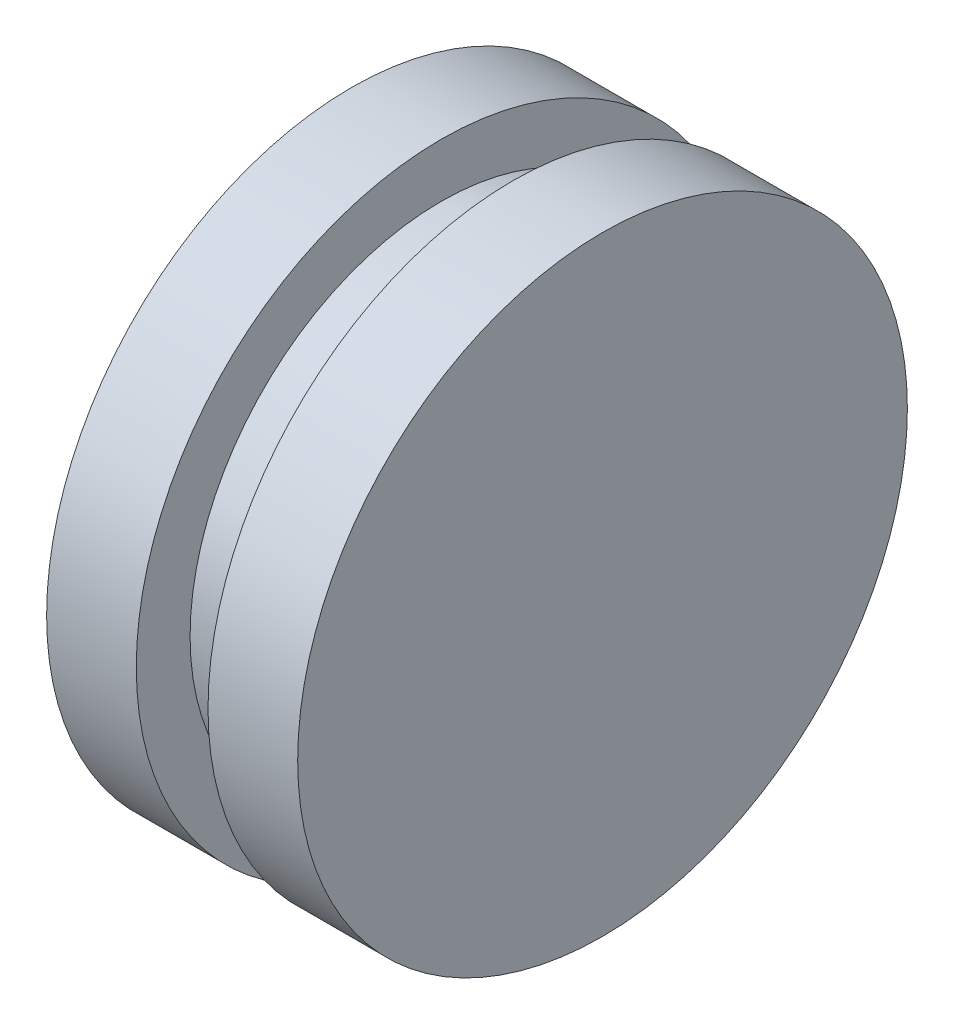
ISO-10303-21;
HEADER;
FILE_DESCRIPTION(('STEP AP214'),'2;1');
FILE_NAME('part.step','',(''),(''),'','','');
FILE_SCHEMA(('AUTOMOTIVE_DESIGN { 1 0 10303 214 1 1 1 1 }'));
ENDSEC;
DATA;
#1=APPLICATION_CONTEXT('core data for automotive mechanical design processes');
#2=APPLICATION_PROTOCOL_DEFINITION('international standard','automotive_design',2000,#1);
#3=PRODUCT_CONTEXT('',#1,'mechanical');
#4=PRODUCT('Part','Part','',(#3));
#5=PRODUCT_RELATED_PRODUCT_CATEGORY('part','',(#4));
#6=PRODUCT_DEFINITION_FORMATION('','',#4);
#7=PRODUCT_DEFINITION_CONTEXT('part definition',#1,'design');
#8=PRODUCT_DEFINITION('design','',#6,#7);
#9=PRODUCT_DEFINITION_SHAPE('','',#8);
#10=(LENGTH_UNIT() NAMED_UNIT(*) SI_UNIT(.MILLI.,.METRE.));
#11=(NAMED_UNIT(*) PLANE_ANGLE_UNIT() SI_UNIT($,.RADIAN.));
#12=(NAMED_UNIT(*) SI_UNIT($,.STERADIAN.) SOLID_ANGLE_UNIT());
#13=UNCERTAINTY_MEASURE_WITH_UNIT(LENGTH_MEASURE(1.E-05),#10,'distance_accuracy_value','');
#14=(GEOMETRIC_REPRESENTATION_CONTEXT(3) GLOBAL_UNCERTAINTY_ASSIGNED_CONTEXT((#13)) GLOBAL_UNIT_ASSIGNED_CONTEXT((#10,
#11,#12)) REPRESENTATION_CONTEXT('',''));
#15=CARTESIAN_POINT('',(0.,0.,0.));
#16=DIRECTION('',(0.,0.,1.));
#17=DIRECTION('',(1.,0.,0.));
#18=AXIS2_PLACEMENT_3D('',#15,#16,#17);
#19=CARTESIAN_POINT('',(0.,0.,0.));
#20=DIRECTION('',(1.,0.,0.));
#21=DIRECTION('',(0.,0.,-1.));
#22=AXIS2_PLACEMENT_3D('',#19,#20,#21);
#23=PLANE('',#22);
#24=CARTESIAN_POINT('',(0.,0.,0.));
#25=DIRECTION('',(1.,0.,0.));
#26=DIRECTION('',(0.,0.,-1.));
#27=AXIS2_PLACEMENT_3D('',#24,#25,#26);
#28=CIRCLE('',#27,17.);
#29=CARTESIAN_POINT('',(0.,0.,-17.));
#30=VERTEX_POINT('',#29);
#31=EDGE_CURVE('E10',#30,#30,#28,.T.);
#32=ORIENTED_EDGE('',*,*,#31,.F.);
#33=EDGE_LOOP('',(#32));
#34=FACE_BOUND('',#33,.T.);
#35=ADVANCED_FACE('F35',(#34),#23,.F.);
#36=CARTESIAN_POINT('',(14.,0.,0.));
#37=DIRECTION('',(1.,0.,0.));
#38=DIRECTION('',(0.,0.,-1.));
#39=AXIS2_PLACEMENT_3D('',#36,#37,#38);
#40=CYLINDRICAL_SURFACE('',#39,17.);
#41=CARTESIAN_POINT('',(5.,0.,0.));
#42=DIRECTION('',(1.,0.,0.));
#43=DIRECTION('',(0.,0.,-1.));
#44=AXIS2_PLACEMENT_3D('',#41,#42,#43);
#45=CIRCLE('',#44,17.);
#46=CARTESIAN_POINT('',(5.,0.,-17.));
#47=VERTEX_POINT('',#46);
#48=EDGE_CURVE('E41',#47,#47,#45,.T.);
#49=ORIENTED_EDGE('',*,*,#48,.F.);
#50=EDGE_LOOP('',(#49));
#51=FACE_BOUND('',#50,.T.);
#52=ORIENTED_EDGE('',*,*,#31,.T.);
#53=EDGE_LOOP('',(#52));
#54=FACE_BOUND('',#53,.T.);
#55=ADVANCED_FACE('F83',(#51,#54),#40,.T.);
#56=CARTESIAN_POINT('',(5.,-17.,0.));
#57=DIRECTION('',(-1.,0.,0.));
#58=DIRECTION('',(0.,0.,1.));
#59=AXIS2_PLACEMENT_3D('',#56,#57,#58);
#60=PLANE('',#59);
#61=CARTESIAN_POINT('',(5.,0.,0.));
#62=DIRECTION('',(1.,0.,0.));
#63=DIRECTION('',(0.,0.,-1.));
#64=AXIS2_PLACEMENT_3D('',#61,#62,#63);
#65=CIRCLE('',#64,14.);
#66=CARTESIAN_POINT('',(5.,0.,-14.));
#67=VERTEX_POINT('',#66);
#68=EDGE_CURVE('E45',#67,#67,#65,.T.);
#69=ORIENTED_EDGE('',*,*,#68,.F.);
#70=EDGE_LOOP('',(#69));
#71=FACE_BOUND('',#70,.T.);
#72=ORIENTED_EDGE('',*,*,#48,.T.);
#73=EDGE_LOOP('',(#72));
#74=FACE_BOUND('',#73,.T.);
#75=ADVANCED_FACE('F78',(#71,#74),#60,.F.);
#76=CARTESIAN_POINT('',(14.,0.,0.));
#77=DIRECTION('',(1.,0.,0.));
#78=DIRECTION('',(0.,0.,-1.));
#79=AXIS2_PLACEMENT_3D('',#76,#77,#78);
#80=CYLINDRICAL_SURFACE('',#79,14.);
#81=CARTESIAN_POINT('',(9.,0.,0.));
#82=DIRECTION('',(1.,0.,0.));
#83=DIRECTION('',(0.,0.,-1.));
#84=AXIS2_PLACEMENT_3D('',#81,#82,#83);
#85=CIRCLE('',#84,14.);
#86=CARTESIAN_POINT('',(9.,0.,-14.));
#87=VERTEX_POINT('',#86);
#88=EDGE_CURVE('E49',#87,#87,#85,.T.);
#89=ORIENTED_EDGE('',*,*,#88,.F.);
#90=EDGE_LOOP('',(#89));
#91=FACE_BOUND('',#90,.T.);
#92=ORIENTED_EDGE('',*,*,#68,.T.);
#93=EDGE_LOOP('',(#92));
#94=FACE_BOUND('',#93,.T.);
#95=ADVANCED_FACE('F72',(#91,#94),#80,.T.);
#96=CARTESIAN_POINT('',(9.,-14.,0.));
#97=DIRECTION('',(1.,0.,0.));
#98=DIRECTION('',(0.,0.,-1.));
#99=AXIS2_PLACEMENT_3D('',#96,#97,#98);
#100=PLANE('',#99);
#101=CARTESIAN_POINT('',(9.,0.,0.));
#102=DIRECTION('',(1.,0.,0.));
#103=DIRECTION('',(0.,0.,-1.));
#104=AXIS2_PLACEMENT_3D('',#101,#102,#103);
#105=CIRCLE('',#104,17.);
#106=CARTESIAN_POINT('',(9.,0.,-17.));
#107=VERTEX_POINT('',#106);
#108=EDGE_CURVE('E54',#107,#107,#105,.T.);
#109=ORIENTED_EDGE('',*,*,#108,.F.);
#110=EDGE_LOOP('',(#109));
#111=FACE_BOUND('',#110,.T.);
#112=ORIENTED_EDGE('',*,*,#88,.T.);
#113=EDGE_LOOP('',(#112));
#114=FACE_BOUND('',#113,.T.);
#115=ADVANCED_FACE('F66',(#111,#114),#100,.F.);
#116=CARTESIAN_POINT('',(14.,0.,0.));
#117=DIRECTION('',(1.,0.,0.));
#118=DIRECTION('',(0.,0.,-1.));
#119=AXIS2_PLACEMENT_3D('',#116,#117,#118);
#120=CYLINDRICAL_SURFACE('',#119,17.);
#121=CARTESIAN_POINT('',(14.,0.,0.));
#122=DIRECTION('',(1.,0.,0.));
#123=DIRECTION('',(0.,0.,-1.));
#124=AXIS2_PLACEMENT_3D('',#121,#122,#123);
#125=CIRCLE('',#124,17.);
#126=CARTESIAN_POINT('',(14.,0.,-17.));
#127=VERTEX_POINT('',#126);
#128=EDGE_CURVE('E57',#127,#127,#125,.T.);
#129=ORIENTED_EDGE('',*,*,#128,.F.);
#130=EDGE_LOOP('',(#129));
#131=FACE_BOUND('',#130,.T.);
#132=ORIENTED_EDGE('',*,*,#108,.T.);
#133=EDGE_LOOP('',(#132));
#134=FACE_BOUND('',#133,.T.);
#135=ADVANCED_FACE('F63',(#131,#134),#120,.T.);
#136=CARTESIAN_POINT('',(14.,-17.,0.));
#137=DIRECTION('',(-1.,0.,0.));
#138=DIRECTION('',(0.,0.,1.));
#139=AXIS2_PLACEMENT_3D('',#136,#137,#138);
#140=PLANE('',#139);
#141=ORIENTED_EDGE('',*,*,#128,.T.);
#142=EDGE_LOOP('',(#141));
#143=FACE_BOUND('',#142,.T.);
#144=ADVANCED_FACE('F61',(#143),#140,.F.);
#145=CLOSED_SHELL('',(#35,#55,#75,#95,#115,#135,#144));
#146=MANIFOLD_SOLID_BREP('B2',#145);
#147=ADVANCED_BREP_SHAPE_REPRESENTATION('',(#18,#146),#14);
#148=SHAPE_DEFINITION_REPRESENTATION(#9,#147);
ENDSEC;
END-ISO-10303-21;
